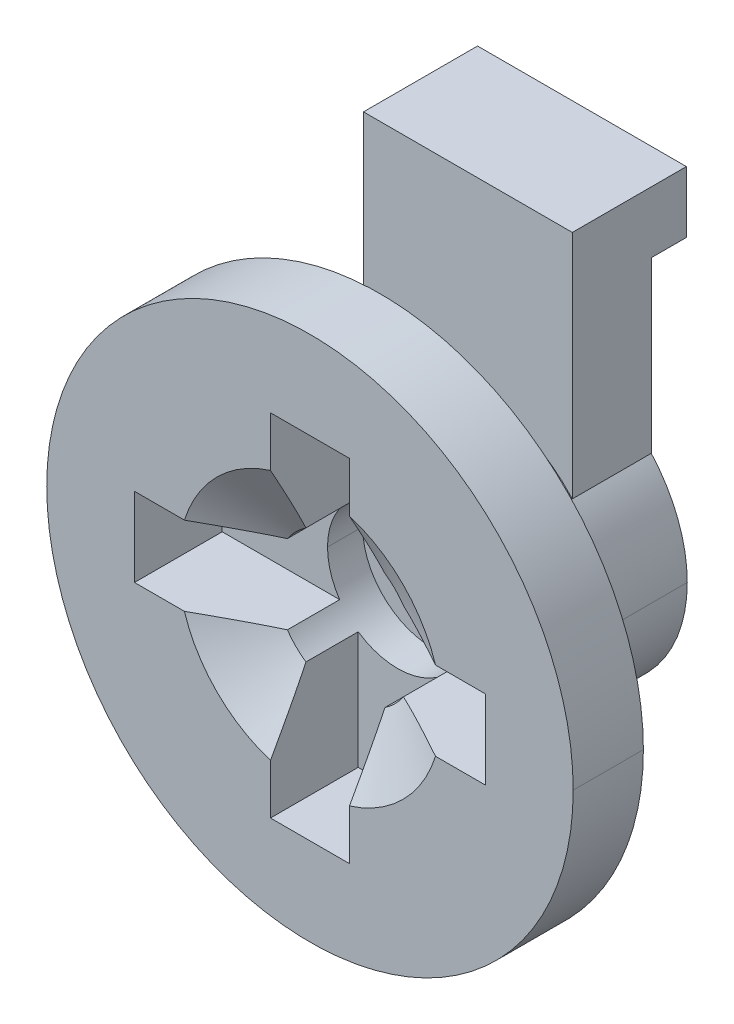
ISO-10303-21;
HEADER;
FILE_DESCRIPTION(('STEP AP214'),'2;1');
FILE_NAME('part.step','',(''),(''),'','','');
FILE_SCHEMA(('AUTOMOTIVE_DESIGN { 1 0 10303 214 1 1 1 1 }'));
ENDSEC;
DATA;
#1=APPLICATION_CONTEXT('core data for automotive mechanical design processes');
#2=APPLICATION_PROTOCOL_DEFINITION('international standard','automotive_design',2000,#1);
#3=PRODUCT_CONTEXT('',#1,'mechanical');
#4=PRODUCT('Part','Part','',(#3));
#5=PRODUCT_RELATED_PRODUCT_CATEGORY('part','',(#4));
#6=PRODUCT_DEFINITION_FORMATION('','',#4);
#7=PRODUCT_DEFINITION_CONTEXT('part definition',#1,'design');
#8=PRODUCT_DEFINITION('design','',#6,#7);
#9=PRODUCT_DEFINITION_SHAPE('','',#8);
#10=(LENGTH_UNIT() NAMED_UNIT(*) SI_UNIT(.MILLI.,.METRE.));
#11=(NAMED_UNIT(*) PLANE_ANGLE_UNIT() SI_UNIT($,.RADIAN.));
#12=(NAMED_UNIT(*) SI_UNIT($,.STERADIAN.) SOLID_ANGLE_UNIT());
#13=UNCERTAINTY_MEASURE_WITH_UNIT(LENGTH_MEASURE(1.E-05),#10,'distance_accuracy_value','');
#14=(GEOMETRIC_REPRESENTATION_CONTEXT(3) GLOBAL_UNCERTAINTY_ASSIGNED_CONTEXT((#13)) GLOBAL_UNIT_ASSIGNED_CONTEXT((#10,
#11,#12)) REPRESENTATION_CONTEXT('',''));
#15=CARTESIAN_POINT('',(0.,0.,0.));
#16=DIRECTION('',(0.,0.,1.));
#17=DIRECTION('',(1.,0.,0.));
#18=AXIS2_PLACEMENT_3D('',#15,#16,#17);
#19=CARTESIAN_POINT('',(0.,0.,0.85));
#20=DIRECTION('',(0.,0.,-1.));
#21=DIRECTION('',(-1.,0.,0.));
#22=AXIS2_PLACEMENT_3D('',#19,#20,#21);
#23=CYLINDRICAL_SURFACE('',#22,0.4);
#24=CARTESIAN_POINT('',(0.,0.,1.05));
#25=DIRECTION('',(0.,0.,-1.));
#26=DIRECTION('',(-1.,0.,0.));
#27=AXIS2_PLACEMENT_3D('',#24,#25,#26);
#28=CIRCLE('',#27,0.4);
#29=CARTESIAN_POINT('',(0.4,0.,1.05));
#30=VERTEX_POINT('',#29);
#31=CARTESIAN_POINT('',(0.330718913883074,-0.225,1.05));
#32=VERTEX_POINT('',#31);
#33=EDGE_CURVE('E11',#30,#32,#28,.T.);
#34=ORIENTED_EDGE('',*,*,#33,.F.);
#35=DIRECTION('',(0.,0.,-1.));
#36=VECTOR('',#35,1.);
#37=CARTESIAN_POINT('',(0.4,0.,0.85));
#38=LINE('',#37,#36);
#39=CARTESIAN_POINT('',(0.4,0.,0.85));
#40=VERTEX_POINT('',#39);
#41=EDGE_CURVE('E23',#30,#40,#38,.T.);
#42=ORIENTED_EDGE('',*,*,#41,.T.);
#43=CARTESIAN_POINT('',(0.,0.,0.85));
#44=DIRECTION('',(0.,0.,-1.));
#45=DIRECTION('',(-1.,0.,0.));
#46=AXIS2_PLACEMENT_3D('',#43,#44,#45);
#47=CIRCLE('',#46,0.4);
#48=CARTESIAN_POINT('',(-0.4,0.,0.85));
#49=VERTEX_POINT('',#48);
#50=EDGE_CURVE('E619',#40,#49,#47,.T.);
#51=ORIENTED_EDGE('',*,*,#50,.T.);
#52=DIRECTION('',(0.,0.,-1.));
#53=VECTOR('',#52,1.);
#54=CARTESIAN_POINT('',(-0.4,0.,0.85));
#55=LINE('',#54,#53);
#56=CARTESIAN_POINT('',(-0.4,0.,1.05));
#57=VERTEX_POINT('',#56);
#58=EDGE_CURVE('E617',#57,#49,#55,.T.);
#59=ORIENTED_EDGE('',*,*,#58,.F.);
#60=CARTESIAN_POINT('',(0.,0.,1.05));
#61=DIRECTION('',(0.,0.,-1.));
#62=DIRECTION('',(-1.,0.,0.));
#63=AXIS2_PLACEMENT_3D('',#60,#61,#62);
#64=CIRCLE('',#63,0.4);
#65=CARTESIAN_POINT('',(-0.330718913883074,-0.225,1.05));
#66=VERTEX_POINT('',#65);
#67=EDGE_CURVE('E615',#66,#57,#64,.T.);
#68=ORIENTED_EDGE('',*,*,#67,.F.);
#69=DIRECTION('',(0.,0.,-1.));
#70=VECTOR('',#69,1.);
#71=CARTESIAN_POINT('',(-0.330718913883074,-0.225,0.85));
#72=LINE('',#71,#70);
#73=CARTESIAN_POINT('',(-0.330718913883074,-0.225,1.34792740578363));
#74=VERTEX_POINT('',#73);
#75=EDGE_CURVE('E605',#74,#66,#72,.T.);
#76=ORIENTED_EDGE('',*,*,#75,.F.);
#77=CARTESIAN_POINT('',(0.,0.,1.34792740578363));
#78=DIRECTION('',(0.,0.,-1.));
#79=DIRECTION('',(-1.,0.,0.));
#80=AXIS2_PLACEMENT_3D('',#77,#78,#79);
#81=CIRCLE('',#80,0.4);
#82=CARTESIAN_POINT('',(-0.225,-0.330718913883074,1.34792740578363));
#83=VERTEX_POINT('',#82);
#84=EDGE_CURVE('E603',#83,#74,#81,.T.);
#85=ORIENTED_EDGE('',*,*,#84,.F.);
#86=DIRECTION('',(0.,0.,1.));
#87=VECTOR('',#86,1.);
#88=CARTESIAN_POINT('',(-0.225,-0.330718913883074,0.85));
#89=LINE('',#88,#87);
#90=CARTESIAN_POINT('',(-0.225,-0.330718913883074,1.05));
#91=VERTEX_POINT('',#90);
#92=EDGE_CURVE('E584',#91,#83,#89,.T.);
#93=ORIENTED_EDGE('',*,*,#92,.F.);
#94=CARTESIAN_POINT('',(0.,0.,1.05));
#95=DIRECTION('',(0.,0.,-1.));
#96=DIRECTION('',(-1.,0.,0.));
#97=AXIS2_PLACEMENT_3D('',#94,#95,#96);
#98=CIRCLE('',#97,0.4);
#99=CARTESIAN_POINT('',(0.225,-0.330718913883074,1.05));
#100=VERTEX_POINT('',#99);
#101=EDGE_CURVE('E600',#100,#91,#98,.T.);
#102=ORIENTED_EDGE('',*,*,#101,.F.);
#103=DIRECTION('',(0.,0.,-1.));
#104=VECTOR('',#103,1.);
#105=CARTESIAN_POINT('',(0.225,-0.330718913883074,0.85));
#106=LINE('',#105,#104);
#107=CARTESIAN_POINT('',(0.225,-0.330718913883074,1.34792740578363));
#108=VERTEX_POINT('',#107);
#109=EDGE_CURVE('E596',#108,#100,#106,.T.);
#110=ORIENTED_EDGE('',*,*,#109,.F.);
#111=CARTESIAN_POINT('',(0.,0.,1.34792740578363));
#112=DIRECTION('',(0.,0.,-1.));
#113=DIRECTION('',(-1.,0.,0.));
#114=AXIS2_PLACEMENT_3D('',#111,#112,#113);
#115=CIRCLE('',#114,0.4);
#116=CARTESIAN_POINT('',(0.330718913883074,-0.225,1.34792740578363));
#117=VERTEX_POINT('',#116);
#118=EDGE_CURVE('E689',#117,#108,#115,.T.);
#119=ORIENTED_EDGE('',*,*,#118,.F.);
#120=DIRECTION('',(0.,0.,1.));
#121=VECTOR('',#120,1.);
#122=CARTESIAN_POINT('',(0.330718913883074,-0.225,0.85));
#123=LINE('',#122,#121);
#124=EDGE_CURVE('E36',#32,#117,#123,.T.);
#125=ORIENTED_EDGE('',*,*,#124,.F.);
#126=EDGE_LOOP('',(#34,#42,#51,#59,#68,#76,#85,#93,#102,#110,#119,#125));
#127=FACE_BOUND('',#126,.T.);
#128=ADVANCED_FACE('F16',(#127),#23,.F.);
#129=CARTESIAN_POINT('',(0.,0.,0.));
#130=DIRECTION('',(0.,0.,1.));
#131=DIRECTION('',(1.,0.,0.));
#132=AXIS2_PLACEMENT_3D('',#129,#130,#131);
#133=CYLINDRICAL_SURFACE('',#132,0.8);
#134=CARTESIAN_POINT('',(0.,0.,0.2));
#135=DIRECTION('',(0.,0.,1.));
#136=DIRECTION('',(1.,0.,0.));
#137=AXIS2_PLACEMENT_3D('',#134,#135,#136);
#138=CIRCLE('',#137,0.8);
#139=CARTESIAN_POINT('',(-0.595,0.534766304099277,0.2));
#140=VERTEX_POINT('',#139);
#141=CARTESIAN_POINT('',(-0.8,0.,0.2));
#142=VERTEX_POINT('',#141);
#143=EDGE_CURVE('E684',#140,#142,#138,.T.);
#144=ORIENTED_EDGE('',*,*,#143,.T.);
#145=DIRECTION('',(0.,0.,1.));
#146=VECTOR('',#145,1.);
#147=CARTESIAN_POINT('',(-0.8,0.,0.));
#148=LINE('',#147,#146);
#149=CARTESIAN_POINT('',(-0.8,0.,0.745854811567268));
#150=VERTEX_POINT('',#149);
#151=EDGE_CURVE('E682',#142,#150,#148,.T.);
#152=ORIENTED_EDGE('',*,*,#151,.T.);
#153=CARTESIAN_POINT('',(0.,0.,0.745854811567268));
#154=DIRECTION('',(0.,0.,1.));
#155=DIRECTION('',(1.,0.,0.));
#156=AXIS2_PLACEMENT_3D('',#153,#154,#155);
#157=CIRCLE('',#156,0.8);
#158=CARTESIAN_POINT('',(0.8,0.,0.745854811567268));
#159=VERTEX_POINT('',#158);
#160=EDGE_CURVE('E679',#159,#150,#157,.T.);
#161=ORIENTED_EDGE('',*,*,#160,.F.);
#162=DIRECTION('',(0.,0.,1.));
#163=VECTOR('',#162,1.);
#164=CARTESIAN_POINT('',(0.8,0.,0.));
#165=LINE('',#164,#163);
#166=CARTESIAN_POINT('',(0.8,0.,0.2));
#167=VERTEX_POINT('',#166);
#168=EDGE_CURVE('E676',#167,#159,#165,.T.);
#169=ORIENTED_EDGE('',*,*,#168,.F.);
#170=CARTESIAN_POINT('',(0.,0.,0.2));
#171=DIRECTION('',(0.,0.,1.));
#172=DIRECTION('',(1.,0.,0.));
#173=AXIS2_PLACEMENT_3D('',#170,#171,#172);
#174=CIRCLE('',#173,0.8);
#175=CARTESIAN_POINT('',(0.595,0.534766304099277,0.2));
#176=VERTEX_POINT('',#175);
#177=EDGE_CURVE('E674',#167,#176,#174,.T.);
#178=ORIENTED_EDGE('',*,*,#177,.T.);
#179=DIRECTION('',(0.,0.,-1.));
#180=VECTOR('',#179,1.);
#181=CARTESIAN_POINT('',(0.595,0.534766304099277,0.));
#182=LINE('',#181,#180);
#183=CARTESIAN_POINT('',(0.595,0.534766304099277,0.65));
#184=VERTEX_POINT('',#183);
#185=EDGE_CURVE('E672',#184,#176,#182,.T.);
#186=ORIENTED_EDGE('',*,*,#185,.F.);
#187=CARTESIAN_POINT('',(0.,0.,0.65));
#188=DIRECTION('',(0.,0.,-1.));
#189=DIRECTION('',(1.,0.,0.));
#190=AXIS2_PLACEMENT_3D('',#187,#188,#189);
#191=CIRCLE('',#190,0.8);
#192=CARTESIAN_POINT('',(-0.595,0.534766304099277,0.65));
#193=VERTEX_POINT('',#192);
#194=EDGE_CURVE('E249',#193,#184,#191,.T.);
#195=ORIENTED_EDGE('',*,*,#194,.F.);
#196=DIRECTION('',(0.,0.,1.));
#197=VECTOR('',#196,1.);
#198=CARTESIAN_POINT('',(-0.595,0.534766304099277,0.));
#199=LINE('',#198,#197);
#200=EDGE_CURVE('E668',#140,#193,#199,.T.);
#201=ORIENTED_EDGE('',*,*,#200,.F.);
#202=EDGE_LOOP('',(#144,#152,#161,#169,#178,#186,#195,#201));
#203=FACE_BOUND('',#202,.T.);
#204=ADVANCED_FACE('F762',(#203),#133,.T.);
#205=CARTESIAN_POINT('',(0.,0.,0.745854811567268));
#206=DIRECTION('',(0.,0.,1.));
#207=DIRECTION('',(1.,0.,0.));
#208=AXIS2_PLACEMENT_3D('',#205,#206,#207);
#209=CONICAL_SURFACE('',#208,0.8,1.0471975511966);
#210=ORIENTED_EDGE('',*,*,#160,.T.);
#211=DIRECTION('',(-0.866025403784441,0.,0.499999999999995));
#212=VECTOR('',#211,1.);
#213=CARTESIAN_POINT('',(-0.8,0.,0.745854811567268));
#214=LINE('',#213,#212);
#215=CARTESIAN_POINT('',(-1.5,0.,1.15));
#216=VERTEX_POINT('',#215);
#217=EDGE_CURVE('E666',#150,#216,#214,.T.);
#218=ORIENTED_EDGE('',*,*,#217,.T.);
#219=CARTESIAN_POINT('',(0.,0.,1.15));
#220=DIRECTION('',(0.,0.,1.));
#221=DIRECTION('',(1.,0.,0.));
#222=AXIS2_PLACEMENT_3D('',#219,#220,#221);
#223=CIRCLE('',#222,1.5);
#224=CARTESIAN_POINT('',(1.5,0.,1.15));
#225=VERTEX_POINT('',#224);
#226=EDGE_CURVE('E663',#225,#216,#223,.T.);
#227=ORIENTED_EDGE('',*,*,#226,.F.);
#228=DIRECTION('',(0.866025403784441,0.,0.499999999999995));
#229=VECTOR('',#228,1.);
#230=CARTESIAN_POINT('',(0.8,0.,0.745854811567268));
#231=LINE('',#230,#229);
#232=EDGE_CURVE('E660',#159,#225,#231,.T.);
#233=ORIENTED_EDGE('',*,*,#232,.F.);
#234=EDGE_LOOP('',(#210,#218,#227,#233));
#235=FACE_BOUND('',#234,.T.);
#236=ADVANCED_FACE('F766',(#235),#209,.T.);
#237=CARTESIAN_POINT('',(0.,0.,0.));
#238=DIRECTION('',(0.,0.,1.));
#239=DIRECTION('',(1.,0.,0.));
#240=AXIS2_PLACEMENT_3D('',#237,#238,#239);
#241=CYLINDRICAL_SURFACE('',#240,1.5);
#242=ORIENTED_EDGE('',*,*,#226,.T.);
#243=DIRECTION('',(0.,0.,1.));
#244=VECTOR('',#243,1.);
#245=CARTESIAN_POINT('',(-1.5,0.,0.));
#246=LINE('',#245,#244);
#247=CARTESIAN_POINT('',(-1.5,0.,1.55));
#248=VERTEX_POINT('',#247);
#249=EDGE_CURVE('E658',#216,#248,#246,.T.);
#250=ORIENTED_EDGE('',*,*,#249,.T.);
#251=CARTESIAN_POINT('',(0.,0.,1.55));
#252=DIRECTION('',(0.,0.,1.));
#253=DIRECTION('',(1.,0.,0.));
#254=AXIS2_PLACEMENT_3D('',#251,#252,#253);
#255=CIRCLE('',#254,1.5);
#256=CARTESIAN_POINT('',(1.5,0.,1.55));
#257=VERTEX_POINT('',#256);
#258=EDGE_CURVE('E655',#257,#248,#255,.T.);
#259=ORIENTED_EDGE('',*,*,#258,.F.);
#260=DIRECTION('',(0.,0.,1.));
#261=VECTOR('',#260,1.);
#262=CARTESIAN_POINT('',(1.5,0.,0.));
#263=LINE('',#262,#261);
#264=EDGE_CURVE('E652',#225,#257,#263,.T.);
#265=ORIENTED_EDGE('',*,*,#264,.F.);
#266=EDGE_LOOP('',(#242,#250,#259,#265));
#267=FACE_BOUND('',#266,.T.);
#268=ADVANCED_FACE('F771',(#267),#241,.T.);
#269=CARTESIAN_POINT('',(0.,0.,0.2));
#270=DIRECTION('',(0.,0.,1.));
#271=DIRECTION('',(1.,0.,0.));
#272=AXIS2_PLACEMENT_3D('',#269,#270,#271);
#273=PLANE('',#272);
#274=DIRECTION('',(0.,-1.,0.));
#275=VECTOR('',#274,1.);
#276=CARTESIAN_POINT('',(0.595,-0.5,0.2));
#277=LINE('',#276,#275);
#278=CARTESIAN_POINT('',(0.595,1.5,0.2));
#279=VERTEX_POINT('',#278);
#280=EDGE_CURVE('E649',#279,#176,#277,.T.);
#281=ORIENTED_EDGE('',*,*,#280,.T.);
#282=ORIENTED_EDGE('',*,*,#177,.F.);
#283=CARTESIAN_POINT('',(0.,0.,0.2));
#284=DIRECTION('',(0.,0.,1.));
#285=DIRECTION('',(1.,0.,0.));
#286=AXIS2_PLACEMENT_3D('',#283,#284,#285);
#287=CIRCLE('',#286,0.8);
#288=EDGE_CURVE('E646',#142,#167,#287,.T.);
#289=ORIENTED_EDGE('',*,*,#288,.F.);
#290=ORIENTED_EDGE('',*,*,#143,.F.);
#291=DIRECTION('',(0.,1.,0.));
#292=VECTOR('',#291,1.);
#293=CARTESIAN_POINT('',(-0.595000000000001,-0.5,0.2));
#294=LINE('',#293,#292);
#295=CARTESIAN_POINT('',(-0.595,1.5,0.2));
#296=VERTEX_POINT('',#295);
#297=EDGE_CURVE('E644',#140,#296,#294,.T.);
#298=ORIENTED_EDGE('',*,*,#297,.T.);
#299=DIRECTION('',(-1.,0.,0.));
#300=VECTOR('',#299,1.);
#301=CARTESIAN_POINT('',(1.5,1.5,0.2));
#302=LINE('',#301,#300);
#303=EDGE_CURVE('E641',#279,#296,#302,.T.);
#304=ORIENTED_EDGE('',*,*,#303,.F.);
#305=EDGE_LOOP('',(#281,#282,#289,#290,#298,#304));
#306=FACE_BOUND('',#305,.T.);
#307=ADVANCED_FACE('F777',(#306),#273,.F.);
#308=CARTESIAN_POINT('',(1.5,1.5,0.2));
#309=DIRECTION('',(0.,-1.,0.));
#310=DIRECTION('',(0.,0.,-1.));
#311=AXIS2_PLACEMENT_3D('',#308,#309,#310);
#312=PLANE('',#311);
#313=ORIENTED_EDGE('',*,*,#303,.T.);
#314=DIRECTION('',(0.,0.,1.));
#315=VECTOR('',#314,1.);
#316=CARTESIAN_POINT('',(-0.595,1.5,0.65));
#317=LINE('',#316,#315);
#318=CARTESIAN_POINT('',(-0.595,1.5,0.));
#319=VERTEX_POINT('',#318);
#320=EDGE_CURVE('E638',#319,#296,#317,.T.);
#321=ORIENTED_EDGE('',*,*,#320,.F.);
#322=DIRECTION('',(-1.,0.,0.));
#323=VECTOR('',#322,1.);
#324=CARTESIAN_POINT('',(1.5,1.5,0.));
#325=LINE('',#324,#323);
#326=CARTESIAN_POINT('',(0.595,1.5,0.));
#327=VERTEX_POINT('',#326);
#328=EDGE_CURVE('E630',#327,#319,#325,.T.);
#329=ORIENTED_EDGE('',*,*,#328,.F.);
#330=DIRECTION('',(0.,0.,-1.));
#331=VECTOR('',#330,1.);
#332=CARTESIAN_POINT('',(0.595,1.5,0.65));
#333=LINE('',#332,#331);
#334=EDGE_CURVE('E627',#279,#327,#333,.T.);
#335=ORIENTED_EDGE('',*,*,#334,.F.);
#336=EDGE_LOOP('',(#313,#321,#329,#335));
#337=FACE_BOUND('',#336,.T.);
#338=ADVANCED_FACE('F781',(#337),#312,.T.);
#339=CARTESIAN_POINT('',(-0.4,0.,0.85));
#340=DIRECTION('',(0.,0.,-1.));
#341=DIRECTION('',(-1.,0.,0.));
#342=AXIS2_PLACEMENT_3D('',#339,#340,#341);
#343=PLANE('',#342);
#344=CARTESIAN_POINT('',(0.,0.,0.85));
#345=DIRECTION('',(0.,0.,-1.));
#346=DIRECTION('',(-1.,0.,0.));
#347=AXIS2_PLACEMENT_3D('',#344,#345,#346);
#348=CIRCLE('',#347,0.4);
#349=EDGE_CURVE('E624',#49,#40,#348,.T.);
#350=ORIENTED_EDGE('',*,*,#349,.F.);
#351=ORIENTED_EDGE('',*,*,#50,.F.);
#352=EDGE_LOOP('',(#350,#351));
#353=FACE_BOUND('',#352,.T.);
#354=ADVANCED_FACE('F784',(#353),#343,.F.);
#355=CARTESIAN_POINT('',(0.,0.,0.85));
#356=DIRECTION('',(0.,0.,-1.));
#357=DIRECTION('',(-1.,0.,0.));
#358=AXIS2_PLACEMENT_3D('',#355,#356,#357);
#359=CYLINDRICAL_SURFACE('',#358,0.4);
#360=ORIENTED_EDGE('',*,*,#41,.F.);
#361=CARTESIAN_POINT('',(0.,0.,1.05));
#362=DIRECTION('',(0.,0.,-1.));
#363=DIRECTION('',(-1.,0.,0.));
#364=AXIS2_PLACEMENT_3D('',#361,#362,#363);
#365=CIRCLE('',#364,0.4);
#366=CARTESIAN_POINT('',(0.330718913883074,0.225,1.05));
#367=VERTEX_POINT('',#366);
#368=EDGE_CURVE('E628',#367,#30,#365,.T.);
#369=ORIENTED_EDGE('',*,*,#368,.F.);
#370=DIRECTION('',(0.,0.,-1.));
#371=VECTOR('',#370,1.);
#372=CARTESIAN_POINT('',(0.330718913883074,0.225,0.85));
#373=LINE('',#372,#371);
#374=CARTESIAN_POINT('',(0.330718913883074,0.225,1.34792740578363));
#375=VERTEX_POINT('',#374);
#376=EDGE_CURVE('E632',#375,#367,#373,.T.);
#377=ORIENTED_EDGE('',*,*,#376,.F.);
#378=CARTESIAN_POINT('',(0.,0.,1.34792740578363));
#379=DIRECTION('',(0.,0.,-1.));
#380=DIRECTION('',(-1.,0.,0.));
#381=AXIS2_PLACEMENT_3D('',#378,#379,#380);
#382=CIRCLE('',#381,0.4);
#383=CARTESIAN_POINT('',(0.225,0.330718913883074,1.34792740578363));
#384=VERTEX_POINT('',#383);
#385=EDGE_CURVE('E707',#384,#375,#382,.T.);
#386=ORIENTED_EDGE('',*,*,#385,.F.);
#387=DIRECTION('',(0.,0.,1.));
#388=VECTOR('',#387,1.);
#389=CARTESIAN_POINT('',(0.225,0.330718913883074,0.85));
#390=LINE('',#389,#388);
#391=CARTESIAN_POINT('',(0.225,0.330718913883074,1.05));
#392=VERTEX_POINT('',#391);
#393=EDGE_CURVE('E716',#392,#384,#390,.T.);
#394=ORIENTED_EDGE('',*,*,#393,.F.);
#395=CARTESIAN_POINT('',(0.,0.,1.05));
#396=DIRECTION('',(0.,0.,-1.));
#397=DIRECTION('',(-1.,0.,0.));
#398=AXIS2_PLACEMENT_3D('',#395,#396,#397);
#399=CIRCLE('',#398,0.4);
#400=CARTESIAN_POINT('',(-0.225,0.330718913883074,1.05));
#401=VERTEX_POINT('',#400);
#402=EDGE_CURVE('E724',#401,#392,#399,.T.);
#403=ORIENTED_EDGE('',*,*,#402,.F.);
#404=DIRECTION('',(0.,0.,-1.));
#405=VECTOR('',#404,1.);
#406=CARTESIAN_POINT('',(-0.225,0.330718913883074,0.85));
#407=LINE('',#406,#405);
#408=CARTESIAN_POINT('',(-0.225,0.330718913883074,1.34792740578363));
#409=VERTEX_POINT('',#408);
#410=EDGE_CURVE('E726',#409,#401,#407,.T.);
#411=ORIENTED_EDGE('',*,*,#410,.F.);
#412=CARTESIAN_POINT('',(0.,0.,1.34792740578363));
#413=DIRECTION('',(0.,0.,-1.));
#414=DIRECTION('',(-1.,0.,0.));
#415=AXIS2_PLACEMENT_3D('',#412,#413,#414);
#416=CIRCLE('',#415,0.4);
#417=CARTESIAN_POINT('',(-0.330718913883074,0.225,1.34792740578363));
#418=VERTEX_POINT('',#417);
#419=EDGE_CURVE('E738',#418,#409,#416,.T.);
#420=ORIENTED_EDGE('',*,*,#419,.F.);
#421=DIRECTION('',(0.,0.,1.));
#422=VECTOR('',#421,1.);
#423=CARTESIAN_POINT('',(-0.330718913883074,0.225,0.85));
#424=LINE('',#423,#422);
#425=CARTESIAN_POINT('',(-0.330718913883074,0.225,1.05));
#426=VERTEX_POINT('',#425);
#427=EDGE_CURVE('E742',#426,#418,#424,.T.);
#428=ORIENTED_EDGE('',*,*,#427,.F.);
#429=CARTESIAN_POINT('',(0.,0.,1.05));
#430=DIRECTION('',(0.,0.,-1.));
#431=DIRECTION('',(-1.,0.,0.));
#432=AXIS2_PLACEMENT_3D('',#429,#430,#431);
#433=CIRCLE('',#432,0.4);
#434=EDGE_CURVE('E746',#57,#426,#433,.T.);
#435=ORIENTED_EDGE('',*,*,#434,.F.);
#436=ORIENTED_EDGE('',*,*,#58,.T.);
#437=ORIENTED_EDGE('',*,*,#349,.T.);
#438=EDGE_LOOP('',(#360,#369,#377,#386,#394,#403,#411,#420,#428,#435,#436,#437));
#439=FACE_BOUND('',#438,.T.);
#440=ADVANCED_FACE('F471',(#439),#359,.F.);
#441=CARTESIAN_POINT('',(0.,0.,1.34792740578363));
#442=DIRECTION('',(0.,0.,1.));
#443=DIRECTION('',(1.,0.,0.));
#444=AXIS2_PLACEMENT_3D('',#441,#442,#443);
#445=CONICAL_SURFACE('',#444,0.4,1.0471975511966);
#446=ORIENTED_EDGE('',*,*,#84,.T.);
#447=CARTESIAN_POINT('',(-0.715454401062709,-0.225,1.55));
#448=CARTESIAN_POINT('',(-0.588541260086254,-0.225,1.48010169226945));
#449=CARTESIAN_POINT('',(-0.461417904029855,-0.225,1.41031678240883));
#450=CARTESIAN_POINT('',(-0.330718913883074,-0.225,1.34792740578363));
#451=B_SPLINE_CURVE_WITH_KNOTS('',3,(#447,#448,#449,#450),.UNSPECIFIED.,.F.,.F.,(4,4),
(0.000426573501781769,0.00086123852664599),.UNSPECIFIED.);
#452=CARTESIAN_POINT('',(-0.715454401062709,-0.225,1.55));
#453=VERTEX_POINT('',#452);
#454=EDGE_CURVE('E492',#453,#74,#451,.T.);
#455=ORIENTED_EDGE('',*,*,#454,.F.);
#456=CARTESIAN_POINT('',(0.,0.,1.55));
#457=DIRECTION('',(0.,0.,-1.));
#458=DIRECTION('',(-1.,0.,0.));
#459=AXIS2_PLACEMENT_3D('',#456,#457,#458);
#460=CIRCLE('',#459,0.75);
#461=CARTESIAN_POINT('',(-0.225,-0.715454401062709,1.55));
#462=VERTEX_POINT('',#461);
#463=EDGE_CURVE('E481',#462,#453,#460,.T.);
#464=ORIENTED_EDGE('',*,*,#463,.F.);
#465=CARTESIAN_POINT('',(-0.225,-0.330718913883074,1.34792740578363));
#466=CARTESIAN_POINT('',(-0.225,-0.461508431815877,1.41035999599549));
#467=CARTESIAN_POINT('',(-0.225,-0.588526166052195,1.48009337912371));
#468=CARTESIAN_POINT('',(-0.225,-0.715454401062709,1.55));
#469=B_SPLINE_CURVE_WITH_KNOTS('',3,(#465,#466,#467,#468),.UNSPECIFIED.,.F.,.F.,(4,4),
(0.000461639527918558,0.000896489172390217),.UNSPECIFIED.);
#470=EDGE_CURVE('E454',#83,#462,#469,.T.);
#471=ORIENTED_EDGE('',*,*,#470,.F.);
#472=EDGE_LOOP('',(#446,#455,#464,#471));
#473=FACE_BOUND('',#472,.T.);
#474=ADVANCED_FACE('F461',(#473),#445,.F.);
#475=CARTESIAN_POINT('',(0.,0.,1.34792740578363));
#476=DIRECTION('',(0.,0.,1.));
#477=DIRECTION('',(1.,0.,0.));
#478=AXIS2_PLACEMENT_3D('',#475,#476,#477);
#479=CONICAL_SURFACE('',#478,0.4,1.0471975511966);
#480=CARTESIAN_POINT('',(0.,0.,1.55));
#481=DIRECTION('',(0.,0.,-1.));
#482=DIRECTION('',(-1.,0.,0.));
#483=AXIS2_PLACEMENT_3D('',#480,#481,#482);
#484=CIRCLE('',#483,0.75);
#485=CARTESIAN_POINT('',(0.715454401062709,-0.225,1.55));
#486=VERTEX_POINT('',#485);
#487=CARTESIAN_POINT('',(0.225,-0.715454401062709,1.55));
#488=VERTEX_POINT('',#487);
#489=EDGE_CURVE('E451',#486,#488,#484,.T.);
#490=ORIENTED_EDGE('',*,*,#489,.F.);
#491=CARTESIAN_POINT('',(0.330718913883073,-0.225,1.34792740578363));
#492=CARTESIAN_POINT('',(0.461508431815876,-0.225,1.41035999599548));
#493=CARTESIAN_POINT('',(0.588526166052195,-0.225,1.48009337912371));
#494=CARTESIAN_POINT('',(0.715454401062709,-0.225,1.55));
#495=B_SPLINE_CURVE_WITH_KNOTS('',3,(#491,#492,#493,#494),.UNSPECIFIED.,.F.,.F.,(4,4),
(0.000461639527918558,0.000896489172390217),.UNSPECIFIED.);
#496=EDGE_CURVE('E447',#117,#486,#495,.T.);
#497=ORIENTED_EDGE('',*,*,#496,.F.);
#498=ORIENTED_EDGE('',*,*,#118,.T.);
#499=CARTESIAN_POINT('',(0.225,-0.715454401062709,1.55));
#500=CARTESIAN_POINT('',(0.225,-0.588541260086254,1.48010169226945));
#501=CARTESIAN_POINT('',(0.225,-0.461417904029855,1.41031678240883));
#502=CARTESIAN_POINT('',(0.225,-0.330718913883074,1.34792740578363));
#503=B_SPLINE_CURVE_WITH_KNOTS('',3,(#499,#500,#501,#502),.UNSPECIFIED.,.F.,.F.,(4,4),
(0.000426573501781769,0.00086123852664599),.UNSPECIFIED.);
#504=EDGE_CURVE('E534',#488,#108,#503,.T.);
#505=ORIENTED_EDGE('',*,*,#504,.F.);
#506=EDGE_LOOP('',(#490,#497,#498,#505));
#507=FACE_BOUND('',#506,.T.);
#508=ADVANCED_FACE('F470',(#507),#479,.F.);
#509=CARTESIAN_POINT('',(0.,0.,1.34792740578363));
#510=DIRECTION('',(0.,0.,1.));
#511=DIRECTION('',(1.,0.,0.));
#512=AXIS2_PLACEMENT_3D('',#509,#510,#511);
#513=CONICAL_SURFACE('',#512,0.4,1.0471975511966);
#514=CARTESIAN_POINT('',(0.,0.,1.55));
#515=DIRECTION('',(0.,0.,-1.));
#516=DIRECTION('',(-1.,0.,0.));
#517=AXIS2_PLACEMENT_3D('',#514,#515,#516);
#518=CIRCLE('',#517,0.75);
#519=CARTESIAN_POINT('',(-0.715454401062709,0.225,1.55));
#520=VERTEX_POINT('',#519);
#521=CARTESIAN_POINT('',(-0.225,0.715454401062709,1.55));
#522=VERTEX_POINT('',#521);
#523=EDGE_CURVE('E531',#520,#522,#518,.T.);
#524=ORIENTED_EDGE('',*,*,#523,.F.);
#525=CARTESIAN_POINT('',(-0.330718913883074,0.225,1.34792740578363));
#526=CARTESIAN_POINT('',(-0.461508431815876,0.225,1.41035999599548));
#527=CARTESIAN_POINT('',(-0.588526166052195,0.225,1.48009337912371));
#528=CARTESIAN_POINT('',(-0.715454401062709,0.225,1.55));
#529=B_SPLINE_CURVE_WITH_KNOTS('',3,(#525,#526,#527,#528),.UNSPECIFIED.,.F.,.F.,(4,4),
(0.000461639527918558,0.000896489172390217),.UNSPECIFIED.);
#530=EDGE_CURVE('E527',#418,#520,#529,.T.);
#531=ORIENTED_EDGE('',*,*,#530,.F.);
#532=ORIENTED_EDGE('',*,*,#419,.T.);
#533=CARTESIAN_POINT('',(-0.225,0.715454401062709,1.55));
#534=CARTESIAN_POINT('',(-0.225,0.588541260086254,1.48010169226945));
#535=CARTESIAN_POINT('',(-0.225,0.461417904029855,1.41031678240883));
#536=CARTESIAN_POINT('',(-0.225,0.330718913883074,1.34792740578363));
#537=B_SPLINE_CURVE_WITH_KNOTS('',3,(#533,#534,#535,#536),.UNSPECIFIED.,.F.,.F.,(4,4),
(0.000426573501781769,0.000861238526645989),.UNSPECIFIED.);
#538=EDGE_CURVE('E708',#522,#409,#537,.T.);
#539=ORIENTED_EDGE('',*,*,#538,.F.);
#540=EDGE_LOOP('',(#524,#531,#532,#539));
#541=FACE_BOUND('',#540,.T.);
#542=ADVANCED_FACE('F390',(#541),#513,.F.);
#543=CARTESIAN_POINT('',(0.,0.,1.34792740578363));
#544=DIRECTION('',(0.,0.,1.));
#545=DIRECTION('',(1.,0.,0.));
#546=AXIS2_PLACEMENT_3D('',#543,#544,#545);
#547=CONICAL_SURFACE('',#546,0.4,1.0471975511966);
#548=ORIENTED_EDGE('',*,*,#385,.T.);
#549=CARTESIAN_POINT('',(0.715454401062709,0.225,1.55));
#550=CARTESIAN_POINT('',(0.588541260086254,0.225,1.48010169226945));
#551=CARTESIAN_POINT('',(0.461417904029855,0.225,1.41031678240883));
#552=CARTESIAN_POINT('',(0.330718913883073,0.225,1.34792740578363));
#553=B_SPLINE_CURVE_WITH_KNOTS('',3,(#549,#550,#551,#552),.UNSPECIFIED.,.F.,.F.,(4,4),
(0.000426573501781769,0.000861238526645989),.UNSPECIFIED.);
#554=CARTESIAN_POINT('',(0.715454401062709,0.225,1.55));
#555=VERTEX_POINT('',#554);
#556=EDGE_CURVE('E412',#555,#375,#553,.T.);
#557=ORIENTED_EDGE('',*,*,#556,.F.);
#558=CARTESIAN_POINT('',(0.,0.,1.55));
#559=DIRECTION('',(0.,0.,-1.));
#560=DIRECTION('',(-1.,0.,0.));
#561=AXIS2_PLACEMENT_3D('',#558,#559,#560);
#562=CIRCLE('',#561,0.75);
#563=CARTESIAN_POINT('',(0.225,0.715454401062709,1.55));
#564=VERTEX_POINT('',#563);
#565=EDGE_CURVE('E401',#564,#555,#562,.T.);
#566=ORIENTED_EDGE('',*,*,#565,.F.);
#567=CARTESIAN_POINT('',(0.225,0.330718913883074,1.34792740578363));
#568=CARTESIAN_POINT('',(0.225,0.461508431815877,1.41035999599549));
#569=CARTESIAN_POINT('',(0.225,0.588526166052195,1.48009337912371));
#570=CARTESIAN_POINT('',(0.225,0.715454401062709,1.55));
#571=B_SPLINE_CURVE_WITH_KNOTS('',3,(#567,#568,#569,#570),.UNSPECIFIED.,.F.,.F.,(4,4),
(0.000461639527918558,0.000896489172390218),.UNSPECIFIED.);
#572=EDGE_CURVE('E372',#384,#564,#571,.T.);
#573=ORIENTED_EDGE('',*,*,#572,.F.);
#574=EDGE_LOOP('',(#548,#557,#566,#573));
#575=FACE_BOUND('',#574,.T.);
#576=ADVANCED_FACE('F379',(#575),#547,.F.);
#577=CARTESIAN_POINT('',(1.,0.225,-1.));
#578=DIRECTION('',(1.,0.,0.));
#579=DIRECTION('',(0.,0.,-1.));
#580=AXIS2_PLACEMENT_3D('',#577,#578,#579);
#581=PLANE('',#580);
#582=DIRECTION('',(0.,0.,1.));
#583=VECTOR('',#582,1.);
#584=CARTESIAN_POINT('',(1.,-0.225,-1.));
#585=LINE('',#584,#583);
#586=CARTESIAN_POINT('',(1.,-0.225,1.05));
#587=VERTEX_POINT('',#586);
#588=CARTESIAN_POINT('',(1.,-0.225,1.55));
#589=VERTEX_POINT('',#588);
#590=EDGE_CURVE('E370',#587,#589,#585,.T.);
#591=ORIENTED_EDGE('',*,*,#590,.T.);
#592=DIRECTION('',(0.,1.,0.));
#593=VECTOR('',#592,1.);
#594=CARTESIAN_POINT('',(1.,0.225,1.55));
#595=LINE('',#594,#593);
#596=CARTESIAN_POINT('',(1.,0.225,1.55));
#597=VERTEX_POINT('',#596);
#598=EDGE_CURVE('E368',#589,#597,#595,.T.);
#599=ORIENTED_EDGE('',*,*,#598,.T.);
#600=DIRECTION('',(0.,0.,1.));
#601=VECTOR('',#600,1.);
#602=CARTESIAN_POINT('',(1.,0.225,-1.));
#603=LINE('',#602,#601);
#604=CARTESIAN_POINT('',(1.,0.225,1.05));
#605=VERTEX_POINT('',#604);
#606=EDGE_CURVE('E365',#605,#597,#603,.T.);
#607=ORIENTED_EDGE('',*,*,#606,.F.);
#608=DIRECTION('',(0.,1.,0.));
#609=VECTOR('',#608,1.);
#610=CARTESIAN_POINT('',(1.,0.225,1.05));
#611=LINE('',#610,#609);
#612=EDGE_CURVE('E362',#587,#605,#611,.T.);
#613=ORIENTED_EDGE('',*,*,#612,.F.);
#614=EDGE_LOOP('',(#591,#599,#607,#613));
#615=FACE_BOUND('',#614,.T.);
#616=ADVANCED_FACE('F389',(#615),#581,.F.);
#617=CARTESIAN_POINT('',(-1.,-0.225,-1.));
#618=DIRECTION('',(0.,-1.,0.));
#619=DIRECTION('',(0.,0.,-1.));
#620=AXIS2_PLACEMENT_3D('',#617,#618,#619);
#621=PLANE('',#620);
#622=ORIENTED_EDGE('',*,*,#124,.T.);
#623=ORIENTED_EDGE('',*,*,#496,.T.);
#624=DIRECTION('',(1.,0.,0.));
#625=VECTOR('',#624,1.);
#626=CARTESIAN_POINT('',(-1.,-0.225,1.55));
#627=LINE('',#626,#625);
#628=EDGE_CURVE('E357',#486,#589,#627,.T.);
#629=ORIENTED_EDGE('',*,*,#628,.T.);
#630=ORIENTED_EDGE('',*,*,#590,.F.);
#631=DIRECTION('',(1.,0.,0.));
#632=VECTOR('',#631,1.);
#633=CARTESIAN_POINT('',(-1.,-0.225,1.05));
#634=LINE('',#633,#632);
#635=EDGE_CURVE('E354',#32,#587,#634,.T.);
#636=ORIENTED_EDGE('',*,*,#635,.F.);
#637=EDGE_LOOP('',(#622,#623,#629,#630,#636));
#638=FACE_BOUND('',#637,.T.);
#639=ADVANCED_FACE('F428',(#638),#621,.F.);
#640=CARTESIAN_POINT('',(-1.,0.225,-1.));
#641=DIRECTION('',(0.,1.,0.));
#642=DIRECTION('',(-1.,0.,0.));
#643=AXIS2_PLACEMENT_3D('',#640,#641,#642);
#644=PLANE('',#643);
#645=DIRECTION('',(-1.,0.,0.));
#646=VECTOR('',#645,1.);
#647=CARTESIAN_POINT('',(-1.,0.225,1.55));
#648=LINE('',#647,#646);
#649=EDGE_CURVE('E349',#597,#555,#648,.T.);
#650=ORIENTED_EDGE('',*,*,#649,.T.);
#651=ORIENTED_EDGE('',*,*,#556,.T.);
#652=ORIENTED_EDGE('',*,*,#376,.T.);
#653=DIRECTION('',(-1.,0.,0.));
#654=VECTOR('',#653,1.);
#655=CARTESIAN_POINT('',(-1.,0.225,1.05));
#656=LINE('',#655,#654);
#657=EDGE_CURVE('E346',#605,#367,#656,.T.);
#658=ORIENTED_EDGE('',*,*,#657,.F.);
#659=ORIENTED_EDGE('',*,*,#606,.T.);
#660=EDGE_LOOP('',(#650,#651,#652,#658,#659));
#661=FACE_BOUND('',#660,.T.);
#662=ADVANCED_FACE('F418',(#661),#644,.F.);
#663=CARTESIAN_POINT('',(-1.,0.225,-1.));
#664=DIRECTION('',(-1.,0.,0.));
#665=DIRECTION('',(0.,0.,1.));
#666=AXIS2_PLACEMENT_3D('',#663,#664,#665);
#667=PLANE('',#666);
#668=DIRECTION('',(0.,0.,1.));
#669=VECTOR('',#668,1.);
#670=CARTESIAN_POINT('',(-1.,0.225,-1.));
#671=LINE('',#670,#669);
#672=CARTESIAN_POINT('',(-1.,0.225,1.05));
#673=VERTEX_POINT('',#672);
#674=CARTESIAN_POINT('',(-1.,0.225,1.55));
#675=VERTEX_POINT('',#674);
#676=EDGE_CURVE('E344',#673,#675,#671,.T.);
#677=ORIENTED_EDGE('',*,*,#676,.T.);
#678=DIRECTION('',(0.,-1.,0.));
#679=VECTOR('',#678,1.);
#680=CARTESIAN_POINT('',(-1.,0.225,1.55));
#681=LINE('',#680,#679);
#682=CARTESIAN_POINT('',(-1.,-0.225,1.55));
#683=VERTEX_POINT('',#682);
#684=EDGE_CURVE('E342',#675,#683,#681,.T.);
#685=ORIENTED_EDGE('',*,*,#684,.T.);
#686=DIRECTION('',(0.,0.,1.));
#687=VECTOR('',#686,1.);
#688=CARTESIAN_POINT('',(-1.,-0.225,-1.));
#689=LINE('',#688,#687);
#690=CARTESIAN_POINT('',(-1.,-0.225,1.05));
#691=VERTEX_POINT('',#690);
#692=EDGE_CURVE('E339',#691,#683,#689,.T.);
#693=ORIENTED_EDGE('',*,*,#692,.F.);
#694=DIRECTION('',(0.,-1.,0.));
#695=VECTOR('',#694,1.);
#696=CARTESIAN_POINT('',(-1.,0.225,1.05));
#697=LINE('',#696,#695);
#698=EDGE_CURVE('E336',#673,#691,#697,.T.);
#699=ORIENTED_EDGE('',*,*,#698,.F.);
#700=EDGE_LOOP('',(#677,#685,#693,#699));
#701=FACE_BOUND('',#700,.T.);
#702=ADVANCED_FACE('F427',(#701),#667,.F.);
#703=CARTESIAN_POINT('',(-1.,0.225,-1.));
#704=DIRECTION('',(0.,1.,0.));
#705=DIRECTION('',(-1.,0.,0.));
#706=AXIS2_PLACEMENT_3D('',#703,#704,#705);
#707=PLANE('',#706);
#708=ORIENTED_EDGE('',*,*,#427,.T.);
#709=ORIENTED_EDGE('',*,*,#530,.T.);
#710=DIRECTION('',(-1.,0.,0.));
#711=VECTOR('',#710,1.);
#712=CARTESIAN_POINT('',(-1.,0.225,1.55));
#713=LINE('',#712,#711);
#714=EDGE_CURVE('E331',#520,#675,#713,.T.);
#715=ORIENTED_EDGE('',*,*,#714,.T.);
#716=ORIENTED_EDGE('',*,*,#676,.F.);
#717=DIRECTION('',(-1.,0.,0.));
#718=VECTOR('',#717,1.);
#719=CARTESIAN_POINT('',(-1.,0.225,1.05));
#720=LINE('',#719,#718);
#721=EDGE_CURVE('E328',#426,#673,#720,.T.);
#722=ORIENTED_EDGE('',*,*,#721,.F.);
#723=EDGE_LOOP('',(#708,#709,#715,#716,#722));
#724=FACE_BOUND('',#723,.T.);
#725=ADVANCED_FACE('F508',(#724),#707,.F.);
#726=CARTESIAN_POINT('',(-1.,-0.225,-1.));
#727=DIRECTION('',(0.,-1.,0.));
#728=DIRECTION('',(0.,0.,-1.));
#729=AXIS2_PLACEMENT_3D('',#726,#727,#728);
#730=PLANE('',#729);
#731=DIRECTION('',(1.,0.,0.));
#732=VECTOR('',#731,1.);
#733=CARTESIAN_POINT('',(-1.,-0.225,1.55));
#734=LINE('',#733,#732);
#735=EDGE_CURVE('E323',#683,#453,#734,.T.);
#736=ORIENTED_EDGE('',*,*,#735,.T.);
#737=ORIENTED_EDGE('',*,*,#454,.T.);
#738=ORIENTED_EDGE('',*,*,#75,.T.);
#739=DIRECTION('',(1.,0.,0.));
#740=VECTOR('',#739,1.);
#741=CARTESIAN_POINT('',(-1.,-0.225,1.05));
#742=LINE('',#741,#740);
#743=EDGE_CURVE('E320',#691,#66,#742,.T.);
#744=ORIENTED_EDGE('',*,*,#743,.F.);
#745=ORIENTED_EDGE('',*,*,#692,.T.);
#746=EDGE_LOOP('',(#736,#737,#738,#744,#745));
#747=FACE_BOUND('',#746,.T.);
#748=ADVANCED_FACE('F498',(#747),#730,.F.);
#749=CARTESIAN_POINT('',(0.,0.,1.05));
#750=DIRECTION('',(0.,0.,-1.));
#751=DIRECTION('',(-1.,0.,0.));
#752=AXIS2_PLACEMENT_3D('',#749,#750,#751);
#753=PLANE('',#752);
#754=ORIENTED_EDGE('',*,*,#743,.T.);
#755=ORIENTED_EDGE('',*,*,#67,.T.);
#756=ORIENTED_EDGE('',*,*,#434,.T.);
#757=ORIENTED_EDGE('',*,*,#721,.T.);
#758=ORIENTED_EDGE('',*,*,#698,.T.);
#759=EDGE_LOOP('',(#754,#755,#756,#757,#758));
#760=FACE_BOUND('',#759,.T.);
#761=ADVANCED_FACE('F507',(#760),#753,.F.);
#762=CARTESIAN_POINT('',(-0.225,1.,1.05));
#763=DIRECTION('',(0.,1.,0.));
#764=DIRECTION('',(0.,0.,1.));
#765=AXIS2_PLACEMENT_3D('',#762,#763,#764);
#766=PLANE('',#765);
#767=DIRECTION('',(-1.,0.,0.));
#768=VECTOR('',#767,1.);
#769=CARTESIAN_POINT('',(-0.225,1.,1.55));
#770=LINE('',#769,#768);
#771=CARTESIAN_POINT('',(0.225,1.,1.55));
#772=VERTEX_POINT('',#771);
#773=CARTESIAN_POINT('',(-0.225,1.,1.55));
#774=VERTEX_POINT('',#773);
#775=EDGE_CURVE('E318',#772,#774,#770,.T.);
#776=ORIENTED_EDGE('',*,*,#775,.T.);
#777=DIRECTION('',(0.,0.,1.));
#778=VECTOR('',#777,1.);
#779=CARTESIAN_POINT('',(-0.225,1.,1.05));
#780=LINE('',#779,#778);
#781=CARTESIAN_POINT('',(-0.225,1.,1.05));
#782=VERTEX_POINT('',#781);
#783=EDGE_CURVE('E315',#782,#774,#780,.T.);
#784=ORIENTED_EDGE('',*,*,#783,.F.);
#785=DIRECTION('',(-1.,0.,0.));
#786=VECTOR('',#785,1.);
#787=CARTESIAN_POINT('',(-0.225,1.,1.05));
#788=LINE('',#787,#786);
#789=CARTESIAN_POINT('',(0.225,1.,1.05));
#790=VERTEX_POINT('',#789);
#791=EDGE_CURVE('E312',#790,#782,#788,.T.);
#792=ORIENTED_EDGE('',*,*,#791,.F.);
#793=DIRECTION('',(0.,0.,1.));
#794=VECTOR('',#793,1.);
#795=CARTESIAN_POINT('',(0.225,1.,1.05));
#796=LINE('',#795,#794);
#797=EDGE_CURVE('E309',#790,#772,#796,.T.);
#798=ORIENTED_EDGE('',*,*,#797,.T.);
#799=EDGE_LOOP('',(#776,#784,#792,#798));
#800=FACE_BOUND('',#799,.T.);
#801=ADVANCED_FACE('F570',(#800),#766,.F.);
#802=CARTESIAN_POINT('',(-0.225,-1.,1.05));
#803=DIRECTION('',(-1.,0.,0.));
#804=DIRECTION('',(0.,0.,1.));
#805=AXIS2_PLACEMENT_3D('',#802,#803,#804);
#806=PLANE('',#805);
#807=ORIENTED_EDGE('',*,*,#92,.T.);
#808=ORIENTED_EDGE('',*,*,#470,.T.);
#809=DIRECTION('',(0.,-1.,0.));
#810=VECTOR('',#809,1.);
#811=CARTESIAN_POINT('',(-0.225,-1.,1.55));
#812=LINE('',#811,#810);
#813=CARTESIAN_POINT('',(-0.225,-1.,1.55));
#814=VERTEX_POINT('',#813);
#815=EDGE_CURVE('E305',#462,#814,#812,.T.);
#816=ORIENTED_EDGE('',*,*,#815,.T.);
#817=DIRECTION('',(0.,0.,1.));
#818=VECTOR('',#817,1.);
#819=CARTESIAN_POINT('',(-0.225,-1.,1.05));
#820=LINE('',#819,#818);
#821=CARTESIAN_POINT('',(-0.225,-1.,1.05));
#822=VERTEX_POINT('',#821);
#823=EDGE_CURVE('E302',#822,#814,#820,.T.);
#824=ORIENTED_EDGE('',*,*,#823,.F.);
#825=DIRECTION('',(0.,-1.,0.));
#826=VECTOR('',#825,1.);
#827=CARTESIAN_POINT('',(-0.225,-1.,1.05));
#828=LINE('',#827,#826);
#829=EDGE_CURVE('E299',#91,#822,#828,.T.);
#830=ORIENTED_EDGE('',*,*,#829,.F.);
#831=EDGE_LOOP('',(#807,#808,#816,#824,#830));
#832=FACE_BOUND('',#831,.T.);
#833=ADVANCED_FACE('F566',(#832),#806,.F.);
#834=CARTESIAN_POINT('',(-0.225,-1.,1.05));
#835=DIRECTION('',(0.,-1.,0.));
#836=DIRECTION('',(0.,0.,-1.));
#837=AXIS2_PLACEMENT_3D('',#834,#835,#836);
#838=PLANE('',#837);
#839=DIRECTION('',(1.,0.,0.));
#840=VECTOR('',#839,1.);
#841=CARTESIAN_POINT('',(-0.225,-1.,1.55));
#842=LINE('',#841,#840);
#843=CARTESIAN_POINT('',(0.225,-1.,1.55));
#844=VERTEX_POINT('',#843);
#845=EDGE_CURVE('E297',#814,#844,#842,.T.);
#846=ORIENTED_EDGE('',*,*,#845,.T.);
#847=DIRECTION('',(0.,0.,1.));
#848=VECTOR('',#847,1.);
#849=CARTESIAN_POINT('',(0.225,-1.,1.05));
#850=LINE('',#849,#848);
#851=CARTESIAN_POINT('',(0.225,-1.,1.05));
#852=VERTEX_POINT('',#851);
#853=EDGE_CURVE('E294',#852,#844,#850,.T.);
#854=ORIENTED_EDGE('',*,*,#853,.F.);
#855=DIRECTION('',(1.,0.,0.));
#856=VECTOR('',#855,1.);
#857=CARTESIAN_POINT('',(-0.225,-1.,1.05));
#858=LINE('',#857,#856);
#859=EDGE_CURVE('E291',#822,#852,#858,.T.);
#860=ORIENTED_EDGE('',*,*,#859,.F.);
#861=ORIENTED_EDGE('',*,*,#823,.T.);
#862=EDGE_LOOP('',(#846,#854,#860,#861));
#863=FACE_BOUND('',#862,.T.);
#864=ADVANCED_FACE('F561',(#863),#838,.F.);
#865=CARTESIAN_POINT('',(0.225,-1.,1.05));
#866=DIRECTION('',(1.,0.,0.));
#867=DIRECTION('',(0.,0.,-1.));
#868=AXIS2_PLACEMENT_3D('',#865,#866,#867);
#869=PLANE('',#868);
#870=DIRECTION('',(0.,1.,0.));
#871=VECTOR('',#870,1.);
#872=CARTESIAN_POINT('',(0.225,-1.,1.55));
#873=LINE('',#872,#871);
#874=EDGE_CURVE('E286',#844,#488,#873,.T.);
#875=ORIENTED_EDGE('',*,*,#874,.T.);
#876=ORIENTED_EDGE('',*,*,#504,.T.);
#877=ORIENTED_EDGE('',*,*,#109,.T.);
#878=DIRECTION('',(0.,1.,0.));
#879=VECTOR('',#878,1.);
#880=CARTESIAN_POINT('',(0.225,-1.,1.05));
#881=LINE('',#880,#879);
#882=EDGE_CURVE('E283',#852,#100,#881,.T.);
#883=ORIENTED_EDGE('',*,*,#882,.F.);
#884=ORIENTED_EDGE('',*,*,#853,.T.);
#885=EDGE_LOOP('',(#875,#876,#877,#883,#884));
#886=FACE_BOUND('',#885,.T.);
#887=ADVANCED_FACE('F550',(#886),#869,.F.);
#888=CARTESIAN_POINT('',(0.,0.,0.));
#889=DIRECTION('',(0.,0.,1.));
#890=DIRECTION('',(1.,0.,0.));
#891=AXIS2_PLACEMENT_3D('',#888,#889,#890);
#892=CYLINDRICAL_SURFACE('',#891,0.8);
#893=ORIENTED_EDGE('',*,*,#151,.F.);
#894=ORIENTED_EDGE('',*,*,#288,.T.);
#895=ORIENTED_EDGE('',*,*,#168,.T.);
#896=CARTESIAN_POINT('',(0.,0.,0.745854811567268));
#897=DIRECTION('',(0.,0.,1.));
#898=DIRECTION('',(1.,0.,0.));
#899=AXIS2_PLACEMENT_3D('',#896,#897,#898);
#900=CIRCLE('',#899,0.8);
#901=EDGE_CURVE('E280',#150,#159,#900,.T.);
#902=ORIENTED_EDGE('',*,*,#901,.F.);
#903=EDGE_LOOP('',(#893,#894,#895,#902));
#904=FACE_BOUND('',#903,.T.);
#905=ADVANCED_FACE('F560',(#904),#892,.T.);
#906=CARTESIAN_POINT('',(0.,0.,0.745854811567268));
#907=DIRECTION('',(0.,0.,1.));
#908=DIRECTION('',(1.,0.,0.));
#909=AXIS2_PLACEMENT_3D('',#906,#907,#908);
#910=CONICAL_SURFACE('',#909,0.8,1.0471975511966);
#911=ORIENTED_EDGE('',*,*,#217,.F.);
#912=ORIENTED_EDGE('',*,*,#901,.T.);
#913=ORIENTED_EDGE('',*,*,#232,.T.);
#914=CARTESIAN_POINT('',(0.,0.,1.15));
#915=DIRECTION('',(0.,0.,1.));
#916=DIRECTION('',(1.,0.,0.));
#917=AXIS2_PLACEMENT_3D('',#914,#915,#916);
#918=CIRCLE('',#917,1.5);
#919=EDGE_CURVE('E277',#216,#225,#918,.T.);
#920=ORIENTED_EDGE('',*,*,#919,.F.);
#921=EDGE_LOOP('',(#911,#912,#913,#920));
#922=FACE_BOUND('',#921,.T.);
#923=ADVANCED_FACE('F879',(#922),#910,.T.);
#924=CARTESIAN_POINT('',(0.,0.,0.));
#925=DIRECTION('',(0.,0.,1.));
#926=DIRECTION('',(1.,0.,0.));
#927=AXIS2_PLACEMENT_3D('',#924,#925,#926);
#928=CYLINDRICAL_SURFACE('',#927,1.5);
#929=ORIENTED_EDGE('',*,*,#249,.F.);
#930=ORIENTED_EDGE('',*,*,#919,.T.);
#931=ORIENTED_EDGE('',*,*,#264,.T.);
#932=CARTESIAN_POINT('',(0.,0.,1.55));
#933=DIRECTION('',(0.,0.,1.));
#934=DIRECTION('',(1.,0.,0.));
#935=AXIS2_PLACEMENT_3D('',#932,#933,#934);
#936=CIRCLE('',#935,1.5);
#937=EDGE_CURVE('E274',#248,#257,#936,.T.);
#938=ORIENTED_EDGE('',*,*,#937,.F.);
#939=EDGE_LOOP('',(#929,#930,#931,#938));
#940=FACE_BOUND('',#939,.T.);
#941=ADVANCED_FACE('F888',(#940),#928,.T.);
#942=CARTESIAN_POINT('',(0.,0.,1.55));
#943=DIRECTION('',(0.,0.,-1.));
#944=DIRECTION('',(-1.,0.,0.));
#945=AXIS2_PLACEMENT_3D('',#942,#943,#944);
#946=PLANE('',#945);
#947=ORIENTED_EDGE('',*,*,#714,.F.);
#948=ORIENTED_EDGE('',*,*,#523,.T.);
#949=DIRECTION('',(0.,-1.,0.));
#950=VECTOR('',#949,1.);
#951=CARTESIAN_POINT('',(-0.225,-1.,1.55));
#952=LINE('',#951,#950);
#953=EDGE_CURVE('E269',#774,#522,#952,.T.);
#954=ORIENTED_EDGE('',*,*,#953,.F.);
#955=ORIENTED_EDGE('',*,*,#775,.F.);
#956=DIRECTION('',(0.,1.,0.));
#957=VECTOR('',#956,1.);
#958=CARTESIAN_POINT('',(0.225,-1.,1.55));
#959=LINE('',#958,#957);
#960=EDGE_CURVE('E264',#564,#772,#959,.T.);
#961=ORIENTED_EDGE('',*,*,#960,.F.);
#962=ORIENTED_EDGE('',*,*,#565,.T.);
#963=ORIENTED_EDGE('',*,*,#649,.F.);
#964=ORIENTED_EDGE('',*,*,#598,.F.);
#965=ORIENTED_EDGE('',*,*,#628,.F.);
#966=ORIENTED_EDGE('',*,*,#489,.T.);
#967=ORIENTED_EDGE('',*,*,#874,.F.);
#968=ORIENTED_EDGE('',*,*,#845,.F.);
#969=ORIENTED_EDGE('',*,*,#815,.F.);
#970=ORIENTED_EDGE('',*,*,#463,.T.);
#971=ORIENTED_EDGE('',*,*,#735,.F.);
#972=ORIENTED_EDGE('',*,*,#684,.F.);
#973=EDGE_LOOP('',(#947,#948,#954,#955,#961,#962,#963,#964,#965,#966,#967,#968,#969,#970,#971,#972));
#974=FACE_BOUND('',#973,.T.);
#975=ORIENTED_EDGE('',*,*,#258,.T.);
#976=ORIENTED_EDGE('',*,*,#937,.T.);
#977=EDGE_LOOP('',(#975,#976));
#978=FACE_BOUND('',#977,.T.);
#979=ADVANCED_FACE('F590',(#974,#978),#946,.F.);
#980=CARTESIAN_POINT('',(0.,0.,0.));
#981=DIRECTION('',(0.,0.,1.));
#982=DIRECTION('',(1.,0.,0.));
#983=AXIS2_PLACEMENT_3D('',#980,#981,#982);
#984=PLANE('',#983);
#985=DIRECTION('',(0.,-1.,0.));
#986=VECTOR('',#985,1.);
#987=CARTESIAN_POINT('',(0.595,-0.5,0.));
#988=LINE('',#987,#986);
#989=CARTESIAN_POINT('',(0.595,1.85,0.));
#990=VERTEX_POINT('',#989);
#991=EDGE_CURVE('E243',#990,#327,#988,.T.);
#992=ORIENTED_EDGE('',*,*,#991,.T.);
#993=ORIENTED_EDGE('',*,*,#328,.T.);
#994=DIRECTION('',(0.,1.,0.));
#995=VECTOR('',#994,1.);
#996=CARTESIAN_POINT('',(-0.595000000000001,-0.5,0.));
#997=LINE('',#996,#995);
#998=CARTESIAN_POINT('',(-0.595,1.85,0.));
#999=VERTEX_POINT('',#998);
#1000=EDGE_CURVE('E261',#319,#999,#997,.T.);
#1001=ORIENTED_EDGE('',*,*,#1000,.T.);
#1002=DIRECTION('',(1.,0.,0.));
#1003=VECTOR('',#1002,1.);
#1004=CARTESIAN_POINT('',(0.595,1.85,0.));
#1005=LINE('',#1004,#1003);
#1006=EDGE_CURVE('E259',#999,#990,#1005,.T.);
#1007=ORIENTED_EDGE('',*,*,#1006,.T.);
#1008=EDGE_LOOP('',(#992,#993,#1001,#1007));
#1009=FACE_BOUND('',#1008,.T.);
#1010=ADVANCED_FACE('F906',(#1009),#984,.F.);
#1011=CARTESIAN_POINT('',(0.595,1.85,0.65));
#1012=DIRECTION('',(0.,1.,0.));
#1013=DIRECTION('',(0.,0.,1.));
#1014=AXIS2_PLACEMENT_3D('',#1011,#1012,#1013);
#1015=PLANE('',#1014);
#1016=ORIENTED_EDGE('',*,*,#1006,.F.);
#1017=DIRECTION('',(0.,0.,-1.));
#1018=VECTOR('',#1017,1.);
#1019=CARTESIAN_POINT('',(-0.595,1.85,0.65));
#1020=LINE('',#1019,#1018);
#1021=CARTESIAN_POINT('',(-0.595,1.85,0.65));
#1022=VERTEX_POINT('',#1021);
#1023=EDGE_CURVE('E230',#1022,#999,#1020,.T.);
#1024=ORIENTED_EDGE('',*,*,#1023,.F.);
#1025=DIRECTION('',(1.,0.,0.));
#1026=VECTOR('',#1025,1.);
#1027=CARTESIAN_POINT('',(0.595,1.85,0.65));
#1028=LINE('',#1027,#1026);
#1029=CARTESIAN_POINT('',(0.595,1.85,0.65));
#1030=VERTEX_POINT('',#1029);
#1031=EDGE_CURVE('E224',#1022,#1030,#1028,.T.);
#1032=ORIENTED_EDGE('',*,*,#1031,.T.);
#1033=DIRECTION('',(0.,0.,-1.));
#1034=VECTOR('',#1033,1.);
#1035=CARTESIAN_POINT('',(0.595,1.85,0.65));
#1036=LINE('',#1035,#1034);
#1037=EDGE_CURVE('E228',#1030,#990,#1036,.T.);
#1038=ORIENTED_EDGE('',*,*,#1037,.T.);
#1039=EDGE_LOOP('',(#1016,#1024,#1032,#1038));
#1040=FACE_BOUND('',#1039,.T.);
#1041=ADVANCED_FACE('F227',(#1040),#1015,.T.);
#1042=CARTESIAN_POINT('',(0.,0.,0.65));
#1043=DIRECTION('',(0.,0.,1.));
#1044=DIRECTION('',(1.,0.,0.));
#1045=AXIS2_PLACEMENT_3D('',#1042,#1043,#1044);
#1046=PLANE('',#1045);
#1047=DIRECTION('',(0.,1.,0.));
#1048=VECTOR('',#1047,1.);
#1049=CARTESIAN_POINT('',(-0.595000000000001,-0.5,0.65));
#1050=LINE('',#1049,#1048);
#1051=EDGE_CURVE('E245',#193,#1022,#1050,.T.);
#1052=ORIENTED_EDGE('',*,*,#1051,.F.);
#1053=ORIENTED_EDGE('',*,*,#194,.T.);
#1054=DIRECTION('',(0.,-1.,0.));
#1055=VECTOR('',#1054,1.);
#1056=CARTESIAN_POINT('',(0.595,-0.5,0.65));
#1057=LINE('',#1056,#1055);
#1058=EDGE_CURVE('E240',#1030,#184,#1057,.T.);
#1059=ORIENTED_EDGE('',*,*,#1058,.F.);
#1060=ORIENTED_EDGE('',*,*,#1031,.F.);
#1061=EDGE_LOOP('',(#1052,#1053,#1059,#1060));
#1062=FACE_BOUND('',#1061,.T.);
#1063=ADVANCED_FACE('F248',(#1062),#1046,.T.);
#1064=CARTESIAN_POINT('',(-0.225,-1.,1.05));
#1065=DIRECTION('',(-1.,0.,0.));
#1066=DIRECTION('',(0.,0.,1.));
#1067=AXIS2_PLACEMENT_3D('',#1064,#1065,#1066);
#1068=PLANE('',#1067);
#1069=ORIENTED_EDGE('',*,*,#953,.T.);
#1070=ORIENTED_EDGE('',*,*,#538,.T.);
#1071=ORIENTED_EDGE('',*,*,#410,.T.);
#1072=DIRECTION('',(0.,-1.,0.));
#1073=VECTOR('',#1072,1.);
#1074=CARTESIAN_POINT('',(-0.225,-1.,1.05));
#1075=LINE('',#1074,#1073);
#1076=EDGE_CURVE('E250',#782,#401,#1075,.T.);
#1077=ORIENTED_EDGE('',*,*,#1076,.F.);
#1078=ORIENTED_EDGE('',*,*,#783,.T.);
#1079=EDGE_LOOP('',(#1069,#1070,#1071,#1077,#1078));
#1080=FACE_BOUND('',#1079,.T.);
#1081=ADVANCED_FACE('F932',(#1080),#1068,.F.);
#1082=CARTESIAN_POINT('',(0.225,-1.,1.05));
#1083=DIRECTION('',(1.,0.,0.));
#1084=DIRECTION('',(0.,0.,-1.));
#1085=AXIS2_PLACEMENT_3D('',#1082,#1083,#1084);
#1086=PLANE('',#1085);
#1087=ORIENTED_EDGE('',*,*,#393,.T.);
#1088=ORIENTED_EDGE('',*,*,#572,.T.);
#1089=ORIENTED_EDGE('',*,*,#960,.T.);
#1090=ORIENTED_EDGE('',*,*,#797,.F.);
#1091=DIRECTION('',(0.,1.,0.));
#1092=VECTOR('',#1091,1.);
#1093=CARTESIAN_POINT('',(0.225,-1.,1.05));
#1094=LINE('',#1093,#1092);
#1095=EDGE_CURVE('E254',#392,#790,#1094,.T.);
#1096=ORIENTED_EDGE('',*,*,#1095,.F.);
#1097=EDGE_LOOP('',(#1087,#1088,#1089,#1090,#1096));
#1098=FACE_BOUND('',#1097,.T.);
#1099=ADVANCED_FACE('F713',(#1098),#1086,.F.);
#1100=CARTESIAN_POINT('',(0.,0.,1.05));
#1101=DIRECTION('',(0.,0.,-1.));
#1102=DIRECTION('',(-1.,0.,0.));
#1103=AXIS2_PLACEMENT_3D('',#1100,#1101,#1102);
#1104=PLANE('',#1103);
#1105=ORIENTED_EDGE('',*,*,#882,.T.);
#1106=ORIENTED_EDGE('',*,*,#101,.T.);
#1107=ORIENTED_EDGE('',*,*,#829,.T.);
#1108=ORIENTED_EDGE('',*,*,#859,.T.);
#1109=EDGE_LOOP('',(#1105,#1106,#1107,#1108));
#1110=FACE_BOUND('',#1109,.T.);
#1111=ADVANCED_FACE('F599',(#1110),#1104,.F.);
#1112=CARTESIAN_POINT('',(0.,0.,1.05));
#1113=DIRECTION('',(0.,0.,-1.));
#1114=DIRECTION('',(-1.,0.,0.));
#1115=AXIS2_PLACEMENT_3D('',#1112,#1113,#1114);
#1116=PLANE('',#1115);
#1117=ORIENTED_EDGE('',*,*,#657,.T.);
#1118=ORIENTED_EDGE('',*,*,#368,.T.);
#1119=ORIENTED_EDGE('',*,*,#33,.T.);
#1120=ORIENTED_EDGE('',*,*,#635,.T.);
#1121=ORIENTED_EDGE('',*,*,#612,.T.);
#1122=EDGE_LOOP('',(#1117,#1118,#1119,#1120,#1121));
#1123=FACE_BOUND('',#1122,.T.);
#1124=ADVANCED_FACE('F703',(#1123),#1116,.F.);
#1125=CARTESIAN_POINT('',(0.,0.,1.05));
#1126=DIRECTION('',(0.,0.,-1.));
#1127=DIRECTION('',(-1.,0.,0.));
#1128=AXIS2_PLACEMENT_3D('',#1125,#1126,#1127);
#1129=PLANE('',#1128);
#1130=ORIENTED_EDGE('',*,*,#1076,.T.);
#1131=ORIENTED_EDGE('',*,*,#402,.T.);
#1132=ORIENTED_EDGE('',*,*,#1095,.T.);
#1133=ORIENTED_EDGE('',*,*,#791,.T.);
#1134=EDGE_LOOP('',(#1130,#1131,#1132,#1133));
#1135=FACE_BOUND('',#1134,.T.);
#1136=ADVANCED_FACE('F721',(#1135),#1129,.F.);
#1137=CARTESIAN_POINT('',(-0.595000000000001,-0.5,0.65));
#1138=DIRECTION('',(-1.,0.,0.));
#1139=DIRECTION('',(0.,-1.,0.));
#1140=AXIS2_PLACEMENT_3D('',#1137,#1138,#1139);
#1141=PLANE('',#1140);
#1142=ORIENTED_EDGE('',*,*,#1000,.F.);
#1143=ORIENTED_EDGE('',*,*,#320,.T.);
#1144=ORIENTED_EDGE('',*,*,#297,.F.);
#1145=ORIENTED_EDGE('',*,*,#200,.T.);
#1146=ORIENTED_EDGE('',*,*,#1051,.T.);
#1147=ORIENTED_EDGE('',*,*,#1023,.T.);
#1148=EDGE_LOOP('',(#1142,#1143,#1144,#1145,#1146,#1147));
#1149=FACE_BOUND('',#1148,.T.);
#1150=ADVANCED_FACE('F974',(#1149),#1141,.T.);
#1151=CARTESIAN_POINT('',(0.595,-0.5,0.65));
#1152=DIRECTION('',(1.,0.,0.));
#1153=DIRECTION('',(0.,1.,0.));
#1154=AXIS2_PLACEMENT_3D('',#1151,#1152,#1153);
#1155=PLANE('',#1154);
#1156=ORIENTED_EDGE('',*,*,#280,.F.);
#1157=ORIENTED_EDGE('',*,*,#334,.T.);
#1158=ORIENTED_EDGE('',*,*,#991,.F.);
#1159=ORIENTED_EDGE('',*,*,#1037,.F.);
#1160=ORIENTED_EDGE('',*,*,#1058,.T.);
#1161=ORIENTED_EDGE('',*,*,#185,.T.);
#1162=EDGE_LOOP('',(#1156,#1157,#1158,#1159,#1160,#1161));
#1163=FACE_BOUND('',#1162,.T.);
#1164=ADVANCED_FACE('F238',(#1163),#1155,.T.);
#1165=CLOSED_SHELL('',(#128,#204,#236,#268,#307,#338,#354,#440,#474,#508,#542,#576,#616,#639,
#662,#702,#725,#748,#761,#801,#833,#864,#887,#905,#923,#941,#979,#1010,#1041,#1063,#1081,#1099,
#1111,#1124,#1136,#1150,#1164));
#1166=MANIFOLD_SOLID_BREP('B1',#1165);
#1167=ADVANCED_BREP_SHAPE_REPRESENTATION('',(#18,#1166),#14);
#1168=SHAPE_DEFINITION_REPRESENTATION(#9,#1167);
ENDSEC;
END-ISO-10303-21;
